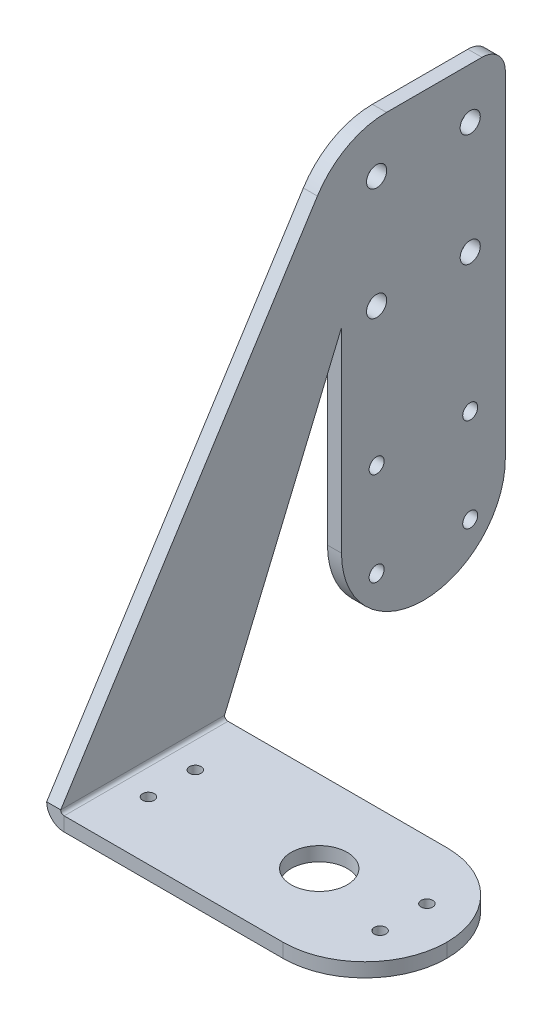
ISO-10303-21;
HEADER;
FILE_DESCRIPTION(('STEP AP214'),'2;1');
FILE_NAME('part.step','',(''),(''),'','','');
FILE_SCHEMA(('AUTOMOTIVE_DESIGN { 1 0 10303 214 1 1 1 1 }'));
ENDSEC;
DATA;
#1=APPLICATION_CONTEXT('core data for automotive mechanical design processes');
#2=APPLICATION_PROTOCOL_DEFINITION('international standard','automotive_design',2000,#1);
#3=PRODUCT_CONTEXT('',#1,'mechanical');
#4=PRODUCT('Part','Part','',(#3));
#5=PRODUCT_RELATED_PRODUCT_CATEGORY('part','',(#4));
#6=PRODUCT_DEFINITION_FORMATION('','',#4);
#7=PRODUCT_DEFINITION_CONTEXT('part definition',#1,'design');
#8=PRODUCT_DEFINITION('design','',#6,#7);
#9=PRODUCT_DEFINITION_SHAPE('','',#8);
#10=(LENGTH_UNIT() NAMED_UNIT(*) SI_UNIT(.MILLI.,.METRE.));
#11=(NAMED_UNIT(*) PLANE_ANGLE_UNIT() SI_UNIT($,.RADIAN.));
#12=(NAMED_UNIT(*) SI_UNIT($,.STERADIAN.) SOLID_ANGLE_UNIT());
#13=UNCERTAINTY_MEASURE_WITH_UNIT(LENGTH_MEASURE(1.E-05),#10,'distance_accuracy_value','');
#14=(GEOMETRIC_REPRESENTATION_CONTEXT(3) GLOBAL_UNCERTAINTY_ASSIGNED_CONTEXT((#13)) GLOBAL_UNIT_ASSIGNED_CONTEXT((#10,
#11,#12)) REPRESENTATION_CONTEXT('',''));
#15=CARTESIAN_POINT('',(0.,0.,0.));
#16=DIRECTION('',(0.,0.,1.));
#17=DIRECTION('',(1.,0.,0.));
#18=AXIS2_PLACEMENT_3D('',#15,#16,#17);
#19=CARTESIAN_POINT('',(0.,-3.,95.));
#20=DIRECTION('',(0.,1.,0.));
#21=DIRECTION('',(0.,0.,1.));
#22=AXIS2_PLACEMENT_3D('',#19,#20,#21);
#23=PLANE('',#22);
#24=CARTESIAN_POINT('',(6.2466000000001,-3.,82.5));
#25=DIRECTION('',(0.,1.,0.));
#26=DIRECTION('',(0.,0.,1.));
#27=AXIS2_PLACEMENT_3D('',#24,#25,#26);
#28=CIRCLE('',#27,1.25);
#29=CARTESIAN_POINT('',(6.2466000000001,-3.,83.75));
#30=VERTEX_POINT('',#29);
#31=EDGE_CURVE('E372',#30,#30,#28,.T.);
#32=ORIENTED_EDGE('',*,*,#31,.T.);
#33=EDGE_LOOP('',(#32));
#34=FACE_BOUND('',#33,.T.);
#35=CARTESIAN_POINT('',(55.7466000000001,-3.,82.5));
#36=DIRECTION('',(0.,1.,0.));
#37=DIRECTION('',(0.,0.,1.));
#38=AXIS2_PLACEMENT_3D('',#35,#36,#37);
#39=CIRCLE('',#38,1.25);
#40=CARTESIAN_POINT('',(55.7466000000001,-3.,83.75));
#41=VERTEX_POINT('',#40);
#42=EDGE_CURVE('E375',#41,#41,#39,.T.);
#43=ORIENTED_EDGE('',*,*,#42,.T.);
#44=EDGE_LOOP('',(#43));
#45=FACE_BOUND('',#44,.T.);
#46=CARTESIAN_POINT('',(55.7466,-3.,72.5));
#47=DIRECTION('',(0.,1.,0.));
#48=DIRECTION('',(0.,0.,1.));
#49=AXIS2_PLACEMENT_3D('',#46,#47,#48);
#50=CIRCLE('',#49,1.25);
#51=CARTESIAN_POINT('',(55.7466,-3.,73.75));
#52=VERTEX_POINT('',#51);
#53=EDGE_CURVE('E378',#52,#52,#50,.T.);
#54=ORIENTED_EDGE('',*,*,#53,.T.);
#55=EDGE_LOOP('',(#54));
#56=FACE_BOUND('',#55,.T.);
#57=CARTESIAN_POINT('',(6.2466,-3.,72.5));
#58=DIRECTION('',(0.,1.,0.));
#59=DIRECTION('',(0.,0.,1.));
#60=AXIS2_PLACEMENT_3D('',#57,#58,#59);
#61=CIRCLE('',#60,1.25);
#62=CARTESIAN_POINT('',(6.2466,-3.,73.75));
#63=VERTEX_POINT('',#62);
#64=EDGE_CURVE('E381',#63,#63,#61,.T.);
#65=ORIENTED_EDGE('',*,*,#64,.T.);
#66=EDGE_LOOP('',(#65));
#67=FACE_BOUND('',#66,.T.);
#68=CARTESIAN_POINT('',(37.7366,-3.,77.4999999999999));
#69=DIRECTION('',(0.,1.,0.));
#70=DIRECTION('',(0.,0.,1.));
#71=AXIS2_PLACEMENT_3D('',#68,#69,#70);
#72=CIRCLE('',#71,6.);
#73=CARTESIAN_POINT('',(37.7366,-3.,83.4999999999999));
#74=VERTEX_POINT('',#73);
#75=EDGE_CURVE('E290',#74,#74,#72,.T.);
#76=ORIENTED_EDGE('',*,*,#75,.T.);
#77=EDGE_LOOP('',(#76));
#78=FACE_BOUND('',#77,.T.);
#79=DIRECTION('',(1.,0.,0.));
#80=VECTOR('',#79,1.);
#81=CARTESIAN_POINT('',(32.8683,-3.,60.));
#82=LINE('',#81,#80);
#83=CARTESIAN_POINT('',(47.5,-3.,60.));
#84=VERTEX_POINT('',#83);
#85=CARTESIAN_POINT('',(0.736600000000011,-3.,60.));
#86=VERTEX_POINT('',#85);
#87=EDGE_CURVE('E187',#84,#86,#82,.F.);
#88=ORIENTED_EDGE('',*,*,#87,.F.);
#89=CARTESIAN_POINT('',(47.5,-3.,77.5));
#90=DIRECTION('',(0.,1.,0.));
#91=DIRECTION('',(0.,0.,1.));
#92=AXIS2_PLACEMENT_3D('',#89,#90,#91);
#93=CIRCLE('',#92,17.5);
#94=CARTESIAN_POINT('',(65.,-3.,77.5));
#95=VERTEX_POINT('',#94);
#96=EDGE_CURVE('E284',#84,#95,#93,.F.);
#97=ORIENTED_EDGE('',*,*,#96,.T.);
#98=CARTESIAN_POINT('',(47.5,-3.,77.5));
#99=DIRECTION('',(0.,1.,0.));
#100=DIRECTION('',(0.,0.,1.));
#101=AXIS2_PLACEMENT_3D('',#98,#99,#100);
#102=CIRCLE('',#101,17.5);
#103=CARTESIAN_POINT('',(47.5,-3.,95.));
#104=VERTEX_POINT('',#103);
#105=EDGE_CURVE('E225',#95,#104,#102,.F.);
#106=ORIENTED_EDGE('',*,*,#105,.T.);
#107=DIRECTION('',(1.,0.,0.));
#108=VECTOR('',#107,1.);
#109=CARTESIAN_POINT('',(0.,-3.,95.));
#110=LINE('',#109,#108);
#111=CARTESIAN_POINT('',(0.7366,-3.,95.));
#112=VERTEX_POINT('',#111);
#113=EDGE_CURVE('E315',#112,#104,#110,.T.);
#114=ORIENTED_EDGE('',*,*,#113,.F.);
#115=DIRECTION('',(0.,0.,-1.));
#116=VECTOR('',#115,1.);
#117=CARTESIAN_POINT('',(0.7366,-3.,95.));
#118=LINE('',#117,#116);
#119=EDGE_CURVE('E308',#112,#86,#118,.T.);
#120=ORIENTED_EDGE('',*,*,#119,.T.);
#121=EDGE_LOOP('',(#88,#97,#106,#114,#120));
#122=FACE_BOUND('',#121,.T.);
#123=ADVANCED_FACE('F69',(#34,#45,#56,#67,#78,#122),#23,.F.);
#124=CARTESIAN_POINT('',(0.,0.,95.));
#125=DIRECTION('',(0.,1.,0.));
#126=DIRECTION('',(0.,0.,1.));
#127=AXIS2_PLACEMENT_3D('',#124,#125,#126);
#128=PLANE('',#127);
#129=CARTESIAN_POINT('',(6.2466000000001,0.,82.5));
#130=DIRECTION('',(0.,1.,0.));
#131=DIRECTION('',(0.,0.,1.));
#132=AXIS2_PLACEMENT_3D('',#129,#130,#131);
#133=CIRCLE('',#132,1.25);
#134=CARTESIAN_POINT('',(6.2466000000001,0.,83.75));
#135=VERTEX_POINT('',#134);
#136=EDGE_CURVE('E388',#135,#135,#133,.T.);
#137=ORIENTED_EDGE('',*,*,#136,.F.);
#138=EDGE_LOOP('',(#137));
#139=FACE_BOUND('',#138,.T.);
#140=CARTESIAN_POINT('',(55.7466000000001,0.,82.5));
#141=DIRECTION('',(0.,1.,0.));
#142=DIRECTION('',(0.,0.,1.));
#143=AXIS2_PLACEMENT_3D('',#140,#141,#142);
#144=CIRCLE('',#143,1.25);
#145=CARTESIAN_POINT('',(55.7466000000001,0.,83.75));
#146=VERTEX_POINT('',#145);
#147=EDGE_CURVE('E391',#146,#146,#144,.T.);
#148=ORIENTED_EDGE('',*,*,#147,.F.);
#149=EDGE_LOOP('',(#148));
#150=FACE_BOUND('',#149,.T.);
#151=CARTESIAN_POINT('',(55.7466,0.,72.5));
#152=DIRECTION('',(0.,1.,0.));
#153=DIRECTION('',(0.,0.,1.));
#154=AXIS2_PLACEMENT_3D('',#151,#152,#153);
#155=CIRCLE('',#154,1.25);
#156=CARTESIAN_POINT('',(55.7466,0.,73.75));
#157=VERTEX_POINT('',#156);
#158=EDGE_CURVE('E387',#157,#157,#155,.T.);
#159=ORIENTED_EDGE('',*,*,#158,.F.);
#160=EDGE_LOOP('',(#159));
#161=FACE_BOUND('',#160,.T.);
#162=CARTESIAN_POINT('',(6.2466,0.,72.5));
#163=DIRECTION('',(0.,1.,0.));
#164=DIRECTION('',(0.,0.,1.));
#165=AXIS2_PLACEMENT_3D('',#162,#163,#164);
#166=CIRCLE('',#165,1.25);
#167=CARTESIAN_POINT('',(6.2466,0.,73.75));
#168=VERTEX_POINT('',#167);
#169=EDGE_CURVE('E384',#168,#168,#166,.T.);
#170=ORIENTED_EDGE('',*,*,#169,.F.);
#171=EDGE_LOOP('',(#170));
#172=FACE_BOUND('',#171,.T.);
#173=CARTESIAN_POINT('',(37.7366,0.,77.4999999999999));
#174=DIRECTION('',(0.,1.,0.));
#175=DIRECTION('',(0.,0.,1.));
#176=AXIS2_PLACEMENT_3D('',#173,#174,#175);
#177=CIRCLE('',#176,6.);
#178=CARTESIAN_POINT('',(37.7366,0.,83.4999999999999));
#179=VERTEX_POINT('',#178);
#180=EDGE_CURVE('E369',#179,#179,#177,.T.);
#181=ORIENTED_EDGE('',*,*,#180,.F.);
#182=EDGE_LOOP('',(#181));
#183=FACE_BOUND('',#182,.T.);
#184=CARTESIAN_POINT('',(47.5,0.,77.5));
#185=DIRECTION('',(0.,1.,0.));
#186=DIRECTION('',(0.,0.,1.));
#187=AXIS2_PLACEMENT_3D('',#184,#185,#186);
#188=CIRCLE('',#187,17.5);
#189=CARTESIAN_POINT('',(47.5,0.,95.));
#190=VERTEX_POINT('',#189);
#191=CARTESIAN_POINT('',(65.,0.,77.5));
#192=VERTEX_POINT('',#191);
#193=EDGE_CURVE('E229',#190,#192,#188,.T.);
#194=ORIENTED_EDGE('',*,*,#193,.T.);
#195=CARTESIAN_POINT('',(47.5,0.,77.5));
#196=DIRECTION('',(0.,1.,0.));
#197=DIRECTION('',(0.,0.,1.));
#198=AXIS2_PLACEMENT_3D('',#195,#196,#197);
#199=CIRCLE('',#198,17.5);
#200=CARTESIAN_POINT('',(47.5,0.,60.));
#201=VERTEX_POINT('',#200);
#202=EDGE_CURVE('E182',#192,#201,#199,.T.);
#203=ORIENTED_EDGE('',*,*,#202,.T.);
#204=DIRECTION('',(-1.,0.,0.));
#205=VECTOR('',#204,1.);
#206=CARTESIAN_POINT('',(0.,0.,60.));
#207=LINE('',#206,#205);
#208=CARTESIAN_POINT('',(0.7366,0.,60.));
#209=VERTEX_POINT('',#208);
#210=EDGE_CURVE('E174',#201,#209,#207,.T.);
#211=ORIENTED_EDGE('',*,*,#210,.T.);
#212=DIRECTION('',(0.,0.,-1.));
#213=VECTOR('',#212,1.);
#214=CARTESIAN_POINT('',(0.7366,0.,95.));
#215=LINE('',#214,#213);
#216=CARTESIAN_POINT('',(0.7366,0.,95.));
#217=VERTEX_POINT('',#216);
#218=EDGE_CURVE('E180',#217,#209,#215,.T.);
#219=ORIENTED_EDGE('',*,*,#218,.F.);
#220=DIRECTION('',(1.,0.,0.));
#221=VECTOR('',#220,1.);
#222=CARTESIAN_POINT('',(0.,0.,95.));
#223=LINE('',#222,#221);
#224=EDGE_CURVE('E321',#217,#190,#223,.T.);
#225=ORIENTED_EDGE('',*,*,#224,.T.);
#226=EDGE_LOOP('',(#194,#203,#211,#219,#225));
#227=FACE_BOUND('',#226,.T.);
#228=ADVANCED_FACE('F177',(#139,#150,#161,#172,#183,#227),#128,.T.);
#229=CARTESIAN_POINT('',(0.7366,0.7366,95.));
#230=DIRECTION('',(0.,0.,-1.));
#231=DIRECTION('',(-1.,0.,0.));
#232=AXIS2_PLACEMENT_3D('',#229,#230,#231);
#233=CYLINDRICAL_SURFACE('',#232,0.7366);
#234=ORIENTED_EDGE('',*,*,#218,.T.);
#235=CARTESIAN_POINT('',(0.7366,0.7366,60.));
#236=DIRECTION('',(0.,0.,1.));
#237=DIRECTION('',(1.,0.,0.));
#238=AXIS2_PLACEMENT_3D('',#235,#236,#237);
#239=CIRCLE('',#238,0.7366);
#240=CARTESIAN_POINT('',(0.,0.7366,60.));
#241=VERTEX_POINT('',#240);
#242=EDGE_CURVE('E186',#241,#209,#239,.T.);
#243=ORIENTED_EDGE('',*,*,#242,.F.);
#244=DIRECTION('',(0.,0.,-1.));
#245=VECTOR('',#244,1.);
#246=CARTESIAN_POINT('',(0.,0.7366,95.));
#247=LINE('',#246,#245);
#248=CARTESIAN_POINT('',(0.,0.7366,95.));
#249=VERTEX_POINT('',#248);
#250=EDGE_CURVE('E211',#249,#241,#247,.T.);
#251=ORIENTED_EDGE('',*,*,#250,.F.);
#252=CARTESIAN_POINT('',(0.7366,0.7366,95.));
#253=DIRECTION('',(0.,0.,-1.));
#254=DIRECTION('',(-1.,0.,0.));
#255=AXIS2_PLACEMENT_3D('',#252,#253,#254);
#256=CIRCLE('',#255,0.7366);
#257=EDGE_CURVE('E209',#249,#217,#256,.F.);
#258=ORIENTED_EDGE('',*,*,#257,.T.);
#259=EDGE_LOOP('',(#234,#243,#251,#258));
#260=FACE_BOUND('',#259,.T.);
#261=ADVANCED_FACE('F207',(#260),#233,.F.);
#262=CARTESIAN_POINT('',(0.7366,0.7366,95.));
#263=DIRECTION('',(0.,0.,-1.));
#264=DIRECTION('',(-1.,0.,0.));
#265=AXIS2_PLACEMENT_3D('',#262,#263,#264);
#266=CYLINDRICAL_SURFACE('',#265,3.7366);
#267=CARTESIAN_POINT('',(0.7366,0.7366,60.));
#268=DIRECTION('',(0.,0.,-1.));
#269=DIRECTION('',(-1.,0.,0.));
#270=AXIS2_PLACEMENT_3D('',#267,#268,#269);
#271=CIRCLE('',#270,3.7366);
#272=CARTESIAN_POINT('',(-3.,0.736600000000014,60.));
#273=VERTEX_POINT('',#272);
#274=EDGE_CURVE('E200',#273,#86,#271,.F.);
#275=ORIENTED_EDGE('',*,*,#274,.T.);
#276=ORIENTED_EDGE('',*,*,#119,.F.);
#277=CARTESIAN_POINT('',(0.7366,0.7366,95.));
#278=DIRECTION('',(0.,0.,1.));
#279=DIRECTION('',(1.,0.,0.));
#280=AXIS2_PLACEMENT_3D('',#277,#278,#279);
#281=CIRCLE('',#280,3.7366);
#282=CARTESIAN_POINT('',(-3.,0.7366,95.));
#283=VERTEX_POINT('',#282);
#284=EDGE_CURVE('E311',#283,#112,#281,.T.);
#285=ORIENTED_EDGE('',*,*,#284,.F.);
#286=DIRECTION('',(0.,0.,-1.));
#287=VECTOR('',#286,1.);
#288=CARTESIAN_POINT('',(-3.,0.7366,95.));
#289=LINE('',#288,#287);
#290=EDGE_CURVE('E303',#283,#273,#289,.T.);
#291=ORIENTED_EDGE('',*,*,#290,.T.);
#292=EDGE_LOOP('',(#275,#276,#285,#291));
#293=FACE_BOUND('',#292,.T.);
#294=ADVANCED_FACE('F438',(#293),#266,.T.);
#295=CARTESIAN_POINT('',(0.,0.,95.));
#296=DIRECTION('',(1.,0.,0.));
#297=DIRECTION('',(0.,0.,-1.));
#298=AXIS2_PLACEMENT_3D('',#295,#296,#297);
#299=PLANE('',#298);
#300=CARTESIAN_POINT('',(0.,30.7366,7.5));
#301=DIRECTION('',(1.,0.,0.));
#302=DIRECTION('',(0.,0.,-1.));
#303=AXIS2_PLACEMENT_3D('',#300,#301,#302);
#304=CIRCLE('',#303,1.6);
#305=CARTESIAN_POINT('',(0.,30.7366,5.9));
#306=VERTEX_POINT('',#305);
#307=EDGE_CURVE('E334',#306,#306,#304,.T.);
#308=ORIENTED_EDGE('',*,*,#307,.F.);
#309=EDGE_LOOP('',(#308));
#310=FACE_BOUND('',#309,.T.);
#311=CARTESIAN_POINT('',(0.,84.2366000000001,27.5));
#312=DIRECTION('',(1.,0.,0.));
#313=DIRECTION('',(0.,0.,-1.));
#314=AXIS2_PLACEMENT_3D('',#311,#312,#313);
#315=CIRCLE('',#314,2.15);
#316=CARTESIAN_POINT('',(0.,84.2366000000001,25.35));
#317=VERTEX_POINT('',#316);
#318=EDGE_CURVE('E331',#317,#317,#315,.T.);
#319=ORIENTED_EDGE('',*,*,#318,.F.);
#320=EDGE_LOOP('',(#319));
#321=FACE_BOUND('',#320,.T.);
#322=CARTESIAN_POINT('',(0.,84.2366000000001,7.5));
#323=DIRECTION('',(1.,0.,0.));
#324=DIRECTION('',(0.,0.,-1.));
#325=AXIS2_PLACEMENT_3D('',#322,#323,#324);
#326=CIRCLE('',#325,2.15);
#327=CARTESIAN_POINT('',(0.,84.2366000000001,5.35));
#328=VERTEX_POINT('',#327);
#329=EDGE_CURVE('E328',#328,#328,#326,.T.);
#330=ORIENTED_EDGE('',*,*,#329,.F.);
#331=EDGE_LOOP('',(#330));
#332=FACE_BOUND('',#331,.T.);
#333=CARTESIAN_POINT('',(0.,60.2366,27.4999999999997));
#334=DIRECTION('',(1.,0.,0.));
#335=DIRECTION('',(0.,0.,-1.));
#336=AXIS2_PLACEMENT_3D('',#333,#334,#335);
#337=CIRCLE('',#336,2.14999999999999);
#338=CARTESIAN_POINT('',(0.,60.2366,25.3499999999998));
#339=VERTEX_POINT('',#338);
#340=EDGE_CURVE('E327',#339,#339,#337,.T.);
#341=ORIENTED_EDGE('',*,*,#340,.F.);
#342=EDGE_LOOP('',(#341));
#343=FACE_BOUND('',#342,.T.);
#344=CARTESIAN_POINT('',(0.,10.7366,7.5));
#345=DIRECTION('',(1.,0.,0.));
#346=DIRECTION('',(0.,0.,-1.));
#347=AXIS2_PLACEMENT_3D('',#344,#345,#346);
#348=CIRCLE('',#347,1.6);
#349=CARTESIAN_POINT('',(0.,10.7366,5.9));
#350=VERTEX_POINT('',#349);
#351=EDGE_CURVE('E337',#350,#350,#348,.T.);
#352=ORIENTED_EDGE('',*,*,#351,.F.);
#353=EDGE_LOOP('',(#352));
#354=FACE_BOUND('',#353,.T.);
#355=CARTESIAN_POINT('',(0.,10.7365999999999,27.5));
#356=DIRECTION('',(1.,0.,0.));
#357=DIRECTION('',(0.,0.,-1.));
#358=AXIS2_PLACEMENT_3D('',#355,#356,#357);
#359=CIRCLE('',#358,1.6);
#360=CARTESIAN_POINT('',(0.,10.7365999999999,25.9));
#361=VERTEX_POINT('',#360);
#362=EDGE_CURVE('E343',#361,#361,#359,.T.);
#363=ORIENTED_EDGE('',*,*,#362,.F.);
#364=EDGE_LOOP('',(#363));
#365=FACE_BOUND('',#364,.T.);
#366=CARTESIAN_POINT('',(0.,30.7365999999999,27.5));
#367=DIRECTION('',(1.,0.,0.));
#368=DIRECTION('',(0.,0.,-1.));
#369=AXIS2_PLACEMENT_3D('',#366,#367,#368);
#370=CIRCLE('',#369,1.6);
#371=CARTESIAN_POINT('',(0.,30.7365999999999,25.9));
#372=VERTEX_POINT('',#371);
#373=EDGE_CURVE('E340',#372,#372,#370,.T.);
#374=ORIENTED_EDGE('',*,*,#373,.F.);
#375=EDGE_LOOP('',(#374));
#376=FACE_BOUND('',#375,.T.);
#377=CARTESIAN_POINT('',(0.,60.2366,7.49999999999975));
#378=DIRECTION('',(1.,0.,0.));
#379=DIRECTION('',(0.,0.,-1.));
#380=AXIS2_PLACEMENT_3D('',#377,#378,#379);
#381=CIRCLE('',#380,2.15);
#382=CARTESIAN_POINT('',(0.,60.2366,5.34999999999975));
#383=VERTEX_POINT('',#382);
#384=EDGE_CURVE('E236',#383,#383,#381,.T.);
#385=ORIENTED_EDGE('',*,*,#384,.F.);
#386=EDGE_LOOP('',(#385));
#387=FACE_BOUND('',#386,.T.);
#388=DIRECTION('',(0.,0.,-1.));
#389=VECTOR('',#388,1.);
#390=CARTESIAN_POINT('',(0.,95.,95.));
#391=LINE('',#390,#389);
#392=CARTESIAN_POINT('',(0.,95.,25.3946676760168));
#393=VERTEX_POINT('',#392);
#394=CARTESIAN_POINT('',(0.,95.,5.));
#395=VERTEX_POINT('',#394);
#396=EDGE_CURVE('E217',#393,#395,#391,.T.);
#397=ORIENTED_EDGE('',*,*,#396,.F.);
#398=CARTESIAN_POINT('',(0.,77.5,25.3946676760168));
#399=DIRECTION('',(1.,0.,0.));
#400=DIRECTION('',(0.,0.,-1.));
#401=AXIS2_PLACEMENT_3D('',#398,#399,#400);
#402=CIRCLE('',#401,17.5);
#403=CARTESIAN_POINT('',(0.,86.8969039770689,40.1577363152174));
#404=VERTEX_POINT('',#403);
#405=EDGE_CURVE('E91',#393,#404,#402,.T.);
#406=ORIENTED_EDGE('',*,*,#405,.T.);
#407=DIRECTION('',(0.,-0.843603922240032,0.536965941546793));
#408=VECTOR('',#407,1.);
#409=CARTESIAN_POINT('',(0.,0.212385662326017,95.3336699107017));
#410=LINE('',#409,#408);
#411=EDGE_CURVE('E355',#404,#249,#410,.T.);
#412=ORIENTED_EDGE('',*,*,#411,.T.);
#413=ORIENTED_EDGE('',*,*,#250,.T.);
#414=DIRECTION('',(0.,0.921373887192149,-0.388677449822381));
#415=VECTOR('',#414,1.);
#416=CARTESIAN_POINT('',(0.,-12.422825568381,65.5512447684325));
#417=LINE('',#416,#415);
#418=CARTESIAN_POINT('',(0.,60.,35.));
#419=VERTEX_POINT('',#418);
#420=EDGE_CURVE('E358',#241,#419,#417,.T.);
#421=ORIENTED_EDGE('',*,*,#420,.T.);
#422=DIRECTION('',(0.,-1.,0.));
#423=VECTOR('',#422,1.);
#424=CARTESIAN_POINT('',(0.,0.,35.));
#425=LINE('',#424,#423);
#426=CARTESIAN_POINT('',(0.,18.2366,35.));
#427=VERTEX_POINT('',#426);
#428=EDGE_CURVE('E350',#419,#427,#425,.T.);
#429=ORIENTED_EDGE('',*,*,#428,.T.);
#430=CARTESIAN_POINT('',(0.,18.2366,17.5));
#431=DIRECTION('',(1.,0.,0.));
#432=DIRECTION('',(0.,0.,-1.));
#433=AXIS2_PLACEMENT_3D('',#430,#431,#432);
#434=CIRCLE('',#433,17.5);
#435=CARTESIAN_POINT('',(0.,0.7366,17.5));
#436=VERTEX_POINT('',#435);
#437=EDGE_CURVE('E273',#427,#436,#434,.T.);
#438=ORIENTED_EDGE('',*,*,#437,.T.);
#439=CARTESIAN_POINT('',(0.,18.2366,17.5));
#440=DIRECTION('',(1.,0.,0.));
#441=DIRECTION('',(0.,0.,-1.));
#442=AXIS2_PLACEMENT_3D('',#439,#440,#441);
#443=CIRCLE('',#442,17.5);
#444=CARTESIAN_POINT('',(0.,18.2366,0.));
#445=VERTEX_POINT('',#444);
#446=EDGE_CURVE('E271',#436,#445,#443,.T.);
#447=ORIENTED_EDGE('',*,*,#446,.T.);
#448=DIRECTION('',(0.,-1.,0.));
#449=VECTOR('',#448,1.);
#450=CARTESIAN_POINT('',(0.,0.,0.));
#451=LINE('',#450,#449);
#452=CARTESIAN_POINT('',(0.,90.,0.));
#453=VERTEX_POINT('',#452);
#454=EDGE_CURVE('E257',#453,#445,#451,.T.);
#455=ORIENTED_EDGE('',*,*,#454,.F.);
#456=CARTESIAN_POINT('',(0.,90.,5.));
#457=DIRECTION('',(1.,0.,0.));
#458=DIRECTION('',(0.,0.,-1.));
#459=AXIS2_PLACEMENT_3D('',#456,#457,#458);
#460=CIRCLE('',#459,5.);
#461=EDGE_CURVE('E260',#453,#395,#460,.T.);
#462=ORIENTED_EDGE('',*,*,#461,.T.);
#463=EDGE_LOOP('',(#397,#406,#412,#413,#421,#429,#438,#447,#455,#462));
#464=FACE_BOUND('',#463,.T.);
#465=ADVANCED_FACE('F300',(#310,#321,#332,#343,#354,#365,#376,#387,#464),#299,.T.);
#466=CARTESIAN_POINT('',(-3.,95.,95.));
#467=DIRECTION('',(0.,1.,0.));
#468=DIRECTION('',(0.,0.,1.));
#469=AXIS2_PLACEMENT_3D('',#466,#467,#468);
#470=PLANE('',#469);
#471=DIRECTION('',(0.,0.,-1.));
#472=VECTOR('',#471,1.);
#473=CARTESIAN_POINT('',(-3.,95.,95.));
#474=LINE('',#473,#472);
#475=CARTESIAN_POINT('',(-3.,95.,25.3946676760168));
#476=VERTEX_POINT('',#475);
#477=CARTESIAN_POINT('',(-3.,95.,5.));
#478=VERTEX_POINT('',#477);
#479=EDGE_CURVE('E297',#476,#478,#474,.T.);
#480=ORIENTED_EDGE('',*,*,#479,.F.);
#481=DIRECTION('',(-1.,0.,0.));
#482=VECTOR('',#481,1.);
#483=CARTESIAN_POINT('',(-3.,95.,25.3946676760168));
#484=LINE('',#483,#482);
#485=EDGE_CURVE('E286',#476,#393,#484,.F.);
#486=ORIENTED_EDGE('',*,*,#485,.T.);
#487=ORIENTED_EDGE('',*,*,#396,.T.);
#488=DIRECTION('',(1.,0.,0.));
#489=VECTOR('',#488,1.);
#490=CARTESIAN_POINT('',(-3.,95.,5.));
#491=LINE('',#490,#489);
#492=EDGE_CURVE('E231',#395,#478,#491,.F.);
#493=ORIENTED_EDGE('',*,*,#492,.T.);
#494=EDGE_LOOP('',(#480,#486,#487,#493));
#495=FACE_BOUND('',#494,.T.);
#496=ADVANCED_FACE('F296',(#495),#470,.T.);
#497=CARTESIAN_POINT('',(-3.,0.,95.));
#498=DIRECTION('',(1.,0.,0.));
#499=DIRECTION('',(0.,0.,-1.));
#500=AXIS2_PLACEMENT_3D('',#497,#498,#499);
#501=PLANE('',#500);
#502=CARTESIAN_POINT('',(-3.,30.7366,7.5));
#503=DIRECTION('',(1.,0.,0.));
#504=DIRECTION('',(0.,0.,-1.));
#505=AXIS2_PLACEMENT_3D('',#502,#503,#504);
#506=CIRCLE('',#505,1.6);
#507=CARTESIAN_POINT('',(-3.,30.7366,5.9));
#508=VERTEX_POINT('',#507);
#509=EDGE_CURVE('E254',#508,#508,#506,.T.);
#510=ORIENTED_EDGE('',*,*,#509,.T.);
#511=EDGE_LOOP('',(#510));
#512=FACE_BOUND('',#511,.T.);
#513=CARTESIAN_POINT('',(-3.,84.2366000000001,27.5));
#514=DIRECTION('',(1.,0.,0.));
#515=DIRECTION('',(0.,0.,-1.));
#516=AXIS2_PLACEMENT_3D('',#513,#514,#515);
#517=CIRCLE('',#516,2.15);
#518=CARTESIAN_POINT('',(-3.,84.2366000000001,25.35));
#519=VERTEX_POINT('',#518);
#520=EDGE_CURVE('E251',#519,#519,#517,.T.);
#521=ORIENTED_EDGE('',*,*,#520,.T.);
#522=EDGE_LOOP('',(#521));
#523=FACE_BOUND('',#522,.T.);
#524=CARTESIAN_POINT('',(-3.,84.2366000000001,7.5));
#525=DIRECTION('',(1.,0.,0.));
#526=DIRECTION('',(0.,0.,-1.));
#527=AXIS2_PLACEMENT_3D('',#524,#525,#526);
#528=CIRCLE('',#527,2.15);
#529=CARTESIAN_POINT('',(-3.,84.2366000000001,5.35));
#530=VERTEX_POINT('',#529);
#531=EDGE_CURVE('E248',#530,#530,#528,.T.);
#532=ORIENTED_EDGE('',*,*,#531,.T.);
#533=EDGE_LOOP('',(#532));
#534=FACE_BOUND('',#533,.T.);
#535=CARTESIAN_POINT('',(-3.,60.2366,27.4999999999997));
#536=DIRECTION('',(1.,0.,0.));
#537=DIRECTION('',(0.,0.,-1.));
#538=AXIS2_PLACEMENT_3D('',#535,#536,#537);
#539=CIRCLE('',#538,2.14999999999999);
#540=CARTESIAN_POINT('',(-3.,60.2366,25.3499999999998));
#541=VERTEX_POINT('',#540);
#542=EDGE_CURVE('E245',#541,#541,#539,.T.);
#543=ORIENTED_EDGE('',*,*,#542,.T.);
#544=EDGE_LOOP('',(#543));
#545=FACE_BOUND('',#544,.T.);
#546=CARTESIAN_POINT('',(-3.,10.7366,7.5));
#547=DIRECTION('',(1.,0.,0.));
#548=DIRECTION('',(0.,0.,-1.));
#549=AXIS2_PLACEMENT_3D('',#546,#547,#548);
#550=CIRCLE('',#549,1.6);
#551=CARTESIAN_POINT('',(-3.,10.7366,5.9));
#552=VERTEX_POINT('',#551);
#553=EDGE_CURVE('E242',#552,#552,#550,.T.);
#554=ORIENTED_EDGE('',*,*,#553,.T.);
#555=EDGE_LOOP('',(#554));
#556=FACE_BOUND('',#555,.T.);
#557=CARTESIAN_POINT('',(-3.,10.7365999999999,27.5));
#558=DIRECTION('',(1.,0.,0.));
#559=DIRECTION('',(0.,0.,-1.));
#560=AXIS2_PLACEMENT_3D('',#557,#558,#559);
#561=CIRCLE('',#560,1.6);
#562=CARTESIAN_POINT('',(-3.,10.7365999999999,25.9));
#563=VERTEX_POINT('',#562);
#564=EDGE_CURVE('E239',#563,#563,#561,.T.);
#565=ORIENTED_EDGE('',*,*,#564,.T.);
#566=EDGE_LOOP('',(#565));
#567=FACE_BOUND('',#566,.T.);
#568=CARTESIAN_POINT('',(-3.,30.7365999999999,27.5));
#569=DIRECTION('',(1.,0.,0.));
#570=DIRECTION('',(0.,0.,-1.));
#571=AXIS2_PLACEMENT_3D('',#568,#569,#570);
#572=CIRCLE('',#571,1.6);
#573=CARTESIAN_POINT('',(-3.,30.7365999999999,25.9));
#574=VERTEX_POINT('',#573);
#575=EDGE_CURVE('E235',#574,#574,#572,.T.);
#576=ORIENTED_EDGE('',*,*,#575,.T.);
#577=EDGE_LOOP('',(#576));
#578=FACE_BOUND('',#577,.T.);
#579=CARTESIAN_POINT('',(-3.,60.2366,7.49999999999975));
#580=DIRECTION('',(1.,0.,0.));
#581=DIRECTION('',(0.,0.,-1.));
#582=AXIS2_PLACEMENT_3D('',#579,#580,#581);
#583=CIRCLE('',#582,2.15);
#584=CARTESIAN_POINT('',(-3.,60.2366,5.34999999999975));
#585=VERTEX_POINT('',#584);
#586=EDGE_CURVE('E232',#585,#585,#583,.T.);
#587=ORIENTED_EDGE('',*,*,#586,.T.);
#588=EDGE_LOOP('',(#587));
#589=FACE_BOUND('',#588,.T.);
#590=DIRECTION('',(0.,-0.843603922240032,0.536965941546793));
#591=VECTOR('',#590,1.);
#592=CARTESIAN_POINT('',(-3.,0.212385662326017,95.3336699107017));
#593=LINE('',#592,#591);
#594=CARTESIAN_POINT('',(-3.,86.8969039770689,40.1577363152174));
#595=VERTEX_POINT('',#594);
#596=EDGE_CURVE('E204',#595,#283,#593,.T.);
#597=ORIENTED_EDGE('',*,*,#596,.F.);
#598=CARTESIAN_POINT('',(-3.,77.5,25.3946676760168));
#599=DIRECTION('',(1.,0.,0.));
#600=DIRECTION('',(0.,0.,-1.));
#601=AXIS2_PLACEMENT_3D('',#598,#599,#600);
#602=CIRCLE('',#601,17.5);
#603=EDGE_CURVE('E12',#595,#476,#602,.F.);
#604=ORIENTED_EDGE('',*,*,#603,.T.);
#605=ORIENTED_EDGE('',*,*,#479,.T.);
#606=CARTESIAN_POINT('',(-3.,90.,5.));
#607=DIRECTION('',(1.,0.,0.));
#608=DIRECTION('',(0.,0.,-1.));
#609=AXIS2_PLACEMENT_3D('',#606,#607,#608);
#610=CIRCLE('',#609,5.);
#611=CARTESIAN_POINT('',(-3.,90.,0.));
#612=VERTEX_POINT('',#611);
#613=EDGE_CURVE('E263',#478,#612,#610,.F.);
#614=ORIENTED_EDGE('',*,*,#613,.T.);
#615=DIRECTION('',(0.,1.,0.));
#616=VECTOR('',#615,1.);
#617=CARTESIAN_POINT('',(-3.,0.,0.));
#618=LINE('',#617,#616);
#619=CARTESIAN_POINT('',(-3.,18.2366,0.));
#620=VERTEX_POINT('',#619);
#621=EDGE_CURVE('E312',#612,#620,#618,.F.);
#622=ORIENTED_EDGE('',*,*,#621,.T.);
#623=CARTESIAN_POINT('',(-3.,18.2366,17.5));
#624=DIRECTION('',(1.,0.,0.));
#625=DIRECTION('',(0.,0.,-1.));
#626=AXIS2_PLACEMENT_3D('',#623,#624,#625);
#627=CIRCLE('',#626,17.5);
#628=CARTESIAN_POINT('',(-3.,0.7366,17.5));
#629=VERTEX_POINT('',#628);
#630=EDGE_CURVE('E275',#620,#629,#627,.F.);
#631=ORIENTED_EDGE('',*,*,#630,.T.);
#632=CARTESIAN_POINT('',(-3.,18.2366,17.5));
#633=DIRECTION('',(1.,0.,0.));
#634=DIRECTION('',(0.,0.,-1.));
#635=AXIS2_PLACEMENT_3D('',#632,#633,#634);
#636=CIRCLE('',#635,17.5);
#637=CARTESIAN_POINT('',(-3.,18.2366,35.));
#638=VERTEX_POINT('',#637);
#639=EDGE_CURVE('E277',#629,#638,#636,.F.);
#640=ORIENTED_EDGE('',*,*,#639,.T.);
#641=DIRECTION('',(0.,1.,0.));
#642=VECTOR('',#641,1.);
#643=CARTESIAN_POINT('',(-3.,30.3683,35.));
#644=LINE('',#643,#642);
#645=CARTESIAN_POINT('',(-3.,60.,35.));
#646=VERTEX_POINT('',#645);
#647=EDGE_CURVE('E354',#646,#638,#644,.F.);
#648=ORIENTED_EDGE('',*,*,#647,.F.);
#649=DIRECTION('',(0.,0.921373887192149,-0.388677449822381));
#650=VECTOR('',#649,1.);
#651=CARTESIAN_POINT('',(-3.,-12.422825568381,65.5512447684325));
#652=LINE('',#651,#650);
#653=EDGE_CURVE('E352',#273,#646,#652,.T.);
#654=ORIENTED_EDGE('',*,*,#653,.F.);
#655=ORIENTED_EDGE('',*,*,#290,.F.);
#656=EDGE_LOOP('',(#597,#604,#605,#614,#622,#631,#640,#648,#654,#655));
#657=FACE_BOUND('',#656,.T.);
#658=ADVANCED_FACE('F445',(#512,#523,#534,#545,#556,#567,#578,#589,#657),#501,.F.);
#659=CARTESIAN_POINT('',(0.7366,0.,95.));
#660=DIRECTION('',(0.,0.,1.));
#661=DIRECTION('',(1.,0.,0.));
#662=AXIS2_PLACEMENT_3D('',#659,#660,#661);
#663=PLANE('',#662);
#664=DIRECTION('',(0.,-1.,0.));
#665=VECTOR('',#664,1.);
#666=CARTESIAN_POINT('',(0.7366,0.,95.));
#667=LINE('',#666,#665);
#668=EDGE_CURVE('E214',#217,#112,#667,.T.);
#669=ORIENTED_EDGE('',*,*,#668,.F.);
#670=ORIENTED_EDGE('',*,*,#257,.F.);
#671=DIRECTION('',(1.,0.,0.));
#672=VECTOR('',#671,1.);
#673=CARTESIAN_POINT('',(-3.,0.7366,95.));
#674=LINE('',#673,#672);
#675=EDGE_CURVE('E210',#283,#249,#674,.T.);
#676=ORIENTED_EDGE('',*,*,#675,.F.);
#677=ORIENTED_EDGE('',*,*,#284,.T.);
#678=EDGE_LOOP('',(#669,#670,#676,#677));
#679=FACE_BOUND('',#678,.T.);
#680=ADVANCED_FACE('F435',(#679),#663,.T.);
#681=CARTESIAN_POINT('',(-3.,0.7366,95.));
#682=DIRECTION('',(0.,0.,1.));
#683=DIRECTION('',(1.,0.,0.));
#684=AXIS2_PLACEMENT_3D('',#681,#682,#683);
#685=PLANE('',#684);
#686=ORIENTED_EDGE('',*,*,#113,.T.);
#687=DIRECTION('',(0.,-1.,0.));
#688=VECTOR('',#687,1.);
#689=CARTESIAN_POINT('',(47.5,0.7366,95.));
#690=LINE('',#689,#688);
#691=EDGE_CURVE('E227',#104,#190,#690,.F.);
#692=ORIENTED_EDGE('',*,*,#691,.T.);
#693=ORIENTED_EDGE('',*,*,#224,.F.);
#694=ORIENTED_EDGE('',*,*,#668,.T.);
#695=EDGE_LOOP('',(#686,#692,#693,#694));
#696=FACE_BOUND('',#695,.T.);
#697=ADVANCED_FACE('F431',(#696),#685,.T.);
#698=CARTESIAN_POINT('',(0.7366,-3.,0.));
#699=DIRECTION('',(0.,0.,-1.));
#700=DIRECTION('',(-1.,0.,0.));
#701=AXIS2_PLACEMENT_3D('',#698,#699,#700);
#702=PLANE('',#701);
#703=ORIENTED_EDGE('',*,*,#454,.T.);
#704=DIRECTION('',(1.,0.,0.));
#705=VECTOR('',#704,1.);
#706=CARTESIAN_POINT('',(0.7366,18.2366,0.));
#707=LINE('',#706,#705);
#708=EDGE_CURVE('E279',#445,#620,#707,.F.);
#709=ORIENTED_EDGE('',*,*,#708,.T.);
#710=ORIENTED_EDGE('',*,*,#621,.F.);
#711=DIRECTION('',(1.,0.,0.));
#712=VECTOR('',#711,1.);
#713=CARTESIAN_POINT('',(0.7366,90.,0.));
#714=LINE('',#713,#712);
#715=EDGE_CURVE('E265',#612,#453,#714,.T.);
#716=ORIENTED_EDGE('',*,*,#715,.T.);
#717=EDGE_LOOP('',(#703,#709,#710,#716));
#718=FACE_BOUND('',#717,.T.);
#719=ADVANCED_FACE('F461',(#718),#702,.T.);
#720=CARTESIAN_POINT('',(47.5,0.,77.5));
#721=DIRECTION('',(0.,-1.,0.));
#722=DIRECTION('',(0.,0.,-1.));
#723=AXIS2_PLACEMENT_3D('',#720,#721,#722);
#724=CYLINDRICAL_SURFACE('',#723,17.5);
#725=ORIENTED_EDGE('',*,*,#193,.F.);
#726=ORIENTED_EDGE('',*,*,#691,.F.);
#727=ORIENTED_EDGE('',*,*,#105,.F.);
#728=DIRECTION('',(0.,-1.,0.));
#729=VECTOR('',#728,1.);
#730=CARTESIAN_POINT('',(65.,0.,77.5));
#731=LINE('',#730,#729);
#732=EDGE_CURVE('E222',#192,#95,#731,.T.);
#733=ORIENTED_EDGE('',*,*,#732,.F.);
#734=EDGE_LOOP('',(#725,#726,#727,#733));
#735=FACE_BOUND('',#734,.T.);
#736=ADVANCED_FACE('F428',(#735),#724,.T.);
#737=CARTESIAN_POINT('',(-10.,60.2366,7.49999999999975));
#738=DIRECTION('',(1.,0.,0.));
#739=DIRECTION('',(0.,0.,-1.));
#740=AXIS2_PLACEMENT_3D('',#737,#738,#739);
#741=CYLINDRICAL_SURFACE('',#740,2.15);
#742=ORIENTED_EDGE('',*,*,#384,.T.);
#743=EDGE_LOOP('',(#742));
#744=FACE_BOUND('',#743,.T.);
#745=ORIENTED_EDGE('',*,*,#586,.F.);
#746=EDGE_LOOP('',(#745));
#747=FACE_BOUND('',#746,.T.);
#748=ADVANCED_FACE('F608',(#744,#747),#741,.F.);
#749=CARTESIAN_POINT('',(-10.,30.7365999999999,27.5));
#750=DIRECTION('',(1.,0.,0.));
#751=DIRECTION('',(0.,0.,-1.));
#752=AXIS2_PLACEMENT_3D('',#749,#750,#751);
#753=CYLINDRICAL_SURFACE('',#752,1.6);
#754=ORIENTED_EDGE('',*,*,#373,.T.);
#755=EDGE_LOOP('',(#754));
#756=FACE_BOUND('',#755,.T.);
#757=ORIENTED_EDGE('',*,*,#575,.F.);
#758=EDGE_LOOP('',(#757));
#759=FACE_BOUND('',#758,.T.);
#760=ADVANCED_FACE('F635',(#756,#759),#753,.F.);
#761=CARTESIAN_POINT('',(-10.,10.7365999999999,27.5));
#762=DIRECTION('',(1.,0.,0.));
#763=DIRECTION('',(0.,0.,-1.));
#764=AXIS2_PLACEMENT_3D('',#761,#762,#763);
#765=CYLINDRICAL_SURFACE('',#764,1.6);
#766=ORIENTED_EDGE('',*,*,#362,.T.);
#767=EDGE_LOOP('',(#766));
#768=FACE_BOUND('',#767,.T.);
#769=ORIENTED_EDGE('',*,*,#564,.F.);
#770=EDGE_LOOP('',(#769));
#771=FACE_BOUND('',#770,.T.);
#772=ADVANCED_FACE('F631',(#768,#771),#765,.F.);
#773=CARTESIAN_POINT('',(-10.,10.7366,7.5));
#774=DIRECTION('',(1.,0.,0.));
#775=DIRECTION('',(0.,0.,-1.));
#776=AXIS2_PLACEMENT_3D('',#773,#774,#775);
#777=CYLINDRICAL_SURFACE('',#776,1.6);
#778=ORIENTED_EDGE('',*,*,#351,.T.);
#779=EDGE_LOOP('',(#778));
#780=FACE_BOUND('',#779,.T.);
#781=ORIENTED_EDGE('',*,*,#553,.F.);
#782=EDGE_LOOP('',(#781));
#783=FACE_BOUND('',#782,.T.);
#784=ADVANCED_FACE('F627',(#780,#783),#777,.F.);
#785=CARTESIAN_POINT('',(-10.,60.2366,27.4999999999997));
#786=DIRECTION('',(1.,0.,0.));
#787=DIRECTION('',(0.,0.,-1.));
#788=AXIS2_PLACEMENT_3D('',#785,#786,#787);
#789=CYLINDRICAL_SURFACE('',#788,2.14999999999999);
#790=ORIENTED_EDGE('',*,*,#340,.T.);
#791=EDGE_LOOP('',(#790));
#792=FACE_BOUND('',#791,.T.);
#793=ORIENTED_EDGE('',*,*,#542,.F.);
#794=EDGE_LOOP('',(#793));
#795=FACE_BOUND('',#794,.T.);
#796=ADVANCED_FACE('F630',(#792,#795),#789,.F.);
#797=CARTESIAN_POINT('',(-10.,84.2366000000001,7.5));
#798=DIRECTION('',(1.,0.,0.));
#799=DIRECTION('',(0.,0.,-1.));
#800=AXIS2_PLACEMENT_3D('',#797,#798,#799);
#801=CYLINDRICAL_SURFACE('',#800,2.15);
#802=ORIENTED_EDGE('',*,*,#329,.T.);
#803=EDGE_LOOP('',(#802));
#804=FACE_BOUND('',#803,.T.);
#805=ORIENTED_EDGE('',*,*,#531,.F.);
#806=EDGE_LOOP('',(#805));
#807=FACE_BOUND('',#806,.T.);
#808=ADVANCED_FACE('F641',(#804,#807),#801,.F.);
#809=CARTESIAN_POINT('',(-10.,84.2366000000001,27.5));
#810=DIRECTION('',(1.,0.,0.));
#811=DIRECTION('',(0.,0.,-1.));
#812=AXIS2_PLACEMENT_3D('',#809,#810,#811);
#813=CYLINDRICAL_SURFACE('',#812,2.15);
#814=ORIENTED_EDGE('',*,*,#318,.T.);
#815=EDGE_LOOP('',(#814));
#816=FACE_BOUND('',#815,.T.);
#817=ORIENTED_EDGE('',*,*,#520,.F.);
#818=EDGE_LOOP('',(#817));
#819=FACE_BOUND('',#818,.T.);
#820=ADVANCED_FACE('F475',(#816,#819),#813,.F.);
#821=CARTESIAN_POINT('',(-10.,30.7366,7.5));
#822=DIRECTION('',(1.,0.,0.));
#823=DIRECTION('',(0.,0.,-1.));
#824=AXIS2_PLACEMENT_3D('',#821,#822,#823);
#825=CYLINDRICAL_SURFACE('',#824,1.6);
#826=ORIENTED_EDGE('',*,*,#307,.T.);
#827=EDGE_LOOP('',(#826));
#828=FACE_BOUND('',#827,.T.);
#829=ORIENTED_EDGE('',*,*,#509,.F.);
#830=EDGE_LOOP('',(#829));
#831=FACE_BOUND('',#830,.T.);
#832=ADVANCED_FACE('F468',(#828,#831),#825,.F.);
#833=CARTESIAN_POINT('',(0.7366,90.,5.));
#834=DIRECTION('',(1.,0.,0.));
#835=DIRECTION('',(0.,0.,-1.));
#836=AXIS2_PLACEMENT_3D('',#833,#834,#835);
#837=CYLINDRICAL_SURFACE('',#836,5.);
#838=ORIENTED_EDGE('',*,*,#613,.F.);
#839=ORIENTED_EDGE('',*,*,#492,.F.);
#840=ORIENTED_EDGE('',*,*,#461,.F.);
#841=ORIENTED_EDGE('',*,*,#715,.F.);
#842=EDGE_LOOP('',(#838,#839,#840,#841));
#843=FACE_BOUND('',#842,.T.);
#844=ADVANCED_FACE('F465',(#843),#837,.T.);
#845=CARTESIAN_POINT('',(0.,0.212385662326017,95.3336699107017));
#846=DIRECTION('',(0.,-0.536965941546793,-0.843603922240032));
#847=DIRECTION('',(0.,-0.843603922240032,0.536965941546793));
#848=AXIS2_PLACEMENT_3D('',#845,#846,#847);
#849=PLANE('',#848);
#850=ORIENTED_EDGE('',*,*,#411,.F.);
#851=DIRECTION('',(1.,0.,0.));
#852=VECTOR('',#851,1.);
#853=CARTESIAN_POINT('',(0.,86.8969039770689,40.1577363152174));
#854=LINE('',#853,#852);
#855=EDGE_CURVE('E77',#404,#595,#854,.F.);
#856=ORIENTED_EDGE('',*,*,#855,.T.);
#857=ORIENTED_EDGE('',*,*,#596,.T.);
#858=ORIENTED_EDGE('',*,*,#675,.T.);
#859=EDGE_LOOP('',(#850,#856,#857,#858));
#860=FACE_BOUND('',#859,.T.);
#861=ADVANCED_FACE('F467',(#860),#849,.F.);
#862=CARTESIAN_POINT('',(0.,0.,35.));
#863=DIRECTION('',(0.,0.,-1.));
#864=DIRECTION('',(0.,-1.,0.));
#865=AXIS2_PLACEMENT_3D('',#862,#863,#864);
#866=PLANE('',#865);
#867=ORIENTED_EDGE('',*,*,#647,.T.);
#868=DIRECTION('',(-1.,0.,0.));
#869=VECTOR('',#868,1.);
#870=CARTESIAN_POINT('',(0.,18.2366,35.));
#871=LINE('',#870,#869);
#872=EDGE_CURVE('E268',#638,#427,#871,.F.);
#873=ORIENTED_EDGE('',*,*,#872,.T.);
#874=ORIENTED_EDGE('',*,*,#428,.F.);
#875=DIRECTION('',(-1.,0.,0.));
#876=VECTOR('',#875,1.);
#877=CARTESIAN_POINT('',(0.,60.,35.));
#878=LINE('',#877,#876);
#879=EDGE_CURVE('E344',#646,#419,#878,.F.);
#880=ORIENTED_EDGE('',*,*,#879,.F.);
#881=EDGE_LOOP('',(#867,#873,#874,#880));
#882=FACE_BOUND('',#881,.T.);
#883=ADVANCED_FACE('F449',(#882),#866,.F.);
#884=CARTESIAN_POINT('',(0.,-12.422825568381,65.5512447684325));
#885=DIRECTION('',(0.,0.388677449822381,0.921373887192149));
#886=DIRECTION('',(0.,0.921373887192149,-0.388677449822381));
#887=AXIS2_PLACEMENT_3D('',#884,#885,#886);
#888=PLANE('',#887);
#889=ORIENTED_EDGE('',*,*,#653,.T.);
#890=ORIENTED_EDGE('',*,*,#879,.T.);
#891=ORIENTED_EDGE('',*,*,#420,.F.);
#892=DIRECTION('',(-1.,0.,0.));
#893=VECTOR('',#892,1.);
#894=CARTESIAN_POINT('',(0.,0.7366,60.));
#895=LINE('',#894,#893);
#896=EDGE_CURVE('E196',#273,#241,#895,.F.);
#897=ORIENTED_EDGE('',*,*,#896,.F.);
#898=EDGE_LOOP('',(#889,#890,#891,#897));
#899=FACE_BOUND('',#898,.T.);
#900=ADVANCED_FACE('F441',(#899),#888,.F.);
#901=CARTESIAN_POINT('',(0.7366,0.7366,60.));
#902=DIRECTION('',(0.,0.,-1.));
#903=DIRECTION('',(-1.,0.,0.));
#904=AXIS2_PLACEMENT_3D('',#901,#902,#903);
#905=PLANE('',#904);
#906=ORIENTED_EDGE('',*,*,#242,.T.);
#907=DIRECTION('',(0.,1.,0.));
#908=VECTOR('',#907,1.);
#909=CARTESIAN_POINT('',(0.7366,0.,60.));
#910=LINE('',#909,#908);
#911=EDGE_CURVE('E193',#209,#86,#910,.F.);
#912=ORIENTED_EDGE('',*,*,#911,.T.);
#913=ORIENTED_EDGE('',*,*,#274,.F.);
#914=ORIENTED_EDGE('',*,*,#896,.T.);
#915=EDGE_LOOP('',(#906,#912,#913,#914));
#916=FACE_BOUND('',#915,.T.);
#917=ADVANCED_FACE('F192',(#916),#905,.T.);
#918=CARTESIAN_POINT('',(0.,0.,60.));
#919=DIRECTION('',(0.,0.,1.));
#920=DIRECTION('',(-1.,0.,0.));
#921=AXIS2_PLACEMENT_3D('',#918,#919,#920);
#922=PLANE('',#921);
#923=ORIENTED_EDGE('',*,*,#210,.F.);
#924=DIRECTION('',(0.,1.,0.));
#925=VECTOR('',#924,1.);
#926=CARTESIAN_POINT('',(47.5,0.,60.));
#927=LINE('',#926,#925);
#928=EDGE_CURVE('E282',#201,#84,#927,.F.);
#929=ORIENTED_EDGE('',*,*,#928,.T.);
#930=ORIENTED_EDGE('',*,*,#87,.T.);
#931=ORIENTED_EDGE('',*,*,#911,.F.);
#932=EDGE_LOOP('',(#923,#929,#930,#931));
#933=FACE_BOUND('',#932,.T.);
#934=ADVANCED_FACE('F202',(#933),#922,.F.);
#935=CARTESIAN_POINT('',(0.7366,18.2366,17.5));
#936=DIRECTION('',(1.,0.,0.));
#937=DIRECTION('',(0.,0.,-1.));
#938=AXIS2_PLACEMENT_3D('',#935,#936,#937);
#939=CYLINDRICAL_SURFACE('',#938,17.5);
#940=DIRECTION('',(-1.,0.,0.));
#941=VECTOR('',#940,1.);
#942=CARTESIAN_POINT('',(0.,0.7366,17.5));
#943=LINE('',#942,#941);
#944=EDGE_CURVE('E287',#629,#436,#943,.F.);
#945=ORIENTED_EDGE('',*,*,#944,.F.);
#946=ORIENTED_EDGE('',*,*,#630,.F.);
#947=ORIENTED_EDGE('',*,*,#708,.F.);
#948=ORIENTED_EDGE('',*,*,#446,.F.);
#949=EDGE_LOOP('',(#945,#946,#947,#948));
#950=FACE_BOUND('',#949,.T.);
#951=ADVANCED_FACE('F457',(#950),#939,.T.);
#952=CARTESIAN_POINT('',(0.,18.2366,17.5));
#953=DIRECTION('',(1.,0.,0.));
#954=DIRECTION('',(0.,0.,-1.));
#955=AXIS2_PLACEMENT_3D('',#952,#953,#954);
#956=CYLINDRICAL_SURFACE('',#955,17.5);
#957=ORIENTED_EDGE('',*,*,#639,.F.);
#958=ORIENTED_EDGE('',*,*,#944,.T.);
#959=ORIENTED_EDGE('',*,*,#437,.F.);
#960=ORIENTED_EDGE('',*,*,#872,.F.);
#961=EDGE_LOOP('',(#957,#958,#959,#960));
#962=FACE_BOUND('',#961,.T.);
#963=ADVANCED_FACE('F452',(#962),#956,.T.);
#964=CARTESIAN_POINT('',(47.5,0.,77.5));
#965=DIRECTION('',(0.,-1.,0.));
#966=DIRECTION('',(0.,0.,-1.));
#967=AXIS2_PLACEMENT_3D('',#964,#965,#966);
#968=CYLINDRICAL_SURFACE('',#967,17.5);
#969=ORIENTED_EDGE('',*,*,#96,.F.);
#970=ORIENTED_EDGE('',*,*,#928,.F.);
#971=ORIENTED_EDGE('',*,*,#202,.F.);
#972=ORIENTED_EDGE('',*,*,#732,.T.);
#973=EDGE_LOOP('',(#969,#970,#971,#972));
#974=FACE_BOUND('',#973,.T.);
#975=ADVANCED_FACE('F424',(#974),#968,.T.);
#976=CARTESIAN_POINT('',(-3.,77.5,25.3946676760168));
#977=DIRECTION('',(-1.,0.,0.));
#978=DIRECTION('',(0.,0.,1.));
#979=AXIS2_PLACEMENT_3D('',#976,#977,#978);
#980=CYLINDRICAL_SURFACE('',#979,17.5);
#981=ORIENTED_EDGE('',*,*,#603,.F.);
#982=ORIENTED_EDGE('',*,*,#855,.F.);
#983=ORIENTED_EDGE('',*,*,#405,.F.);
#984=ORIENTED_EDGE('',*,*,#485,.F.);
#985=EDGE_LOOP('',(#981,#982,#983,#984));
#986=FACE_BOUND('',#985,.T.);
#987=ADVANCED_FACE('F71',(#986),#980,.T.);
#988=CARTESIAN_POINT('',(37.7366,-10.,77.4999999999999));
#989=DIRECTION('',(0.,1.,0.));
#990=DIRECTION('',(0.,0.,1.));
#991=AXIS2_PLACEMENT_3D('',#988,#989,#990);
#992=CYLINDRICAL_SURFACE('',#991,6.);
#993=ORIENTED_EDGE('',*,*,#180,.T.);
#994=EDGE_LOOP('',(#993));
#995=FACE_BOUND('',#994,.T.);
#996=ORIENTED_EDGE('',*,*,#75,.F.);
#997=EDGE_LOOP('',(#996));
#998=FACE_BOUND('',#997,.T.);
#999=ADVANCED_FACE('F408',(#995,#998),#992,.F.);
#1000=CARTESIAN_POINT('',(6.2466,-10.,72.5));
#1001=DIRECTION('',(0.,1.,0.));
#1002=DIRECTION('',(0.,0.,1.));
#1003=AXIS2_PLACEMENT_3D('',#1000,#1001,#1002);
#1004=CYLINDRICAL_SURFACE('',#1003,1.25);
#1005=ORIENTED_EDGE('',*,*,#169,.T.);
#1006=EDGE_LOOP('',(#1005));
#1007=FACE_BOUND('',#1006,.T.);
#1008=ORIENTED_EDGE('',*,*,#64,.F.);
#1009=EDGE_LOOP('',(#1008));
#1010=FACE_BOUND('',#1009,.T.);
#1011=ADVANCED_FACE('F411',(#1007,#1010),#1004,.F.);
#1012=CARTESIAN_POINT('',(55.7466,-10.,72.5));
#1013=DIRECTION('',(0.,1.,0.));
#1014=DIRECTION('',(0.,0.,1.));
#1015=AXIS2_PLACEMENT_3D('',#1012,#1013,#1014);
#1016=CYLINDRICAL_SURFACE('',#1015,1.25);
#1017=ORIENTED_EDGE('',*,*,#158,.T.);
#1018=EDGE_LOOP('',(#1017));
#1019=FACE_BOUND('',#1018,.T.);
#1020=ORIENTED_EDGE('',*,*,#53,.F.);
#1021=EDGE_LOOP('',(#1020));
#1022=FACE_BOUND('',#1021,.T.);
#1023=ADVANCED_FACE('F397',(#1019,#1022),#1016,.F.);
#1024=CARTESIAN_POINT('',(55.7466000000001,-10.,82.5));
#1025=DIRECTION('',(0.,1.,0.));
#1026=DIRECTION('',(0.,0.,1.));
#1027=AXIS2_PLACEMENT_3D('',#1024,#1025,#1026);
#1028=CYLINDRICAL_SURFACE('',#1027,1.25);
#1029=ORIENTED_EDGE('',*,*,#147,.T.);
#1030=EDGE_LOOP('',(#1029));
#1031=FACE_BOUND('',#1030,.T.);
#1032=ORIENTED_EDGE('',*,*,#42,.F.);
#1033=EDGE_LOOP('',(#1032));
#1034=FACE_BOUND('',#1033,.T.);
#1035=ADVANCED_FACE('F510',(#1031,#1034),#1028,.F.);
#1036=CARTESIAN_POINT('',(6.2466000000001,-10.,82.5));
#1037=DIRECTION('',(0.,1.,0.));
#1038=DIRECTION('',(0.,0.,1.));
#1039=AXIS2_PLACEMENT_3D('',#1036,#1037,#1038);
#1040=CYLINDRICAL_SURFACE('',#1039,1.25);
#1041=ORIENTED_EDGE('',*,*,#136,.T.);
#1042=EDGE_LOOP('',(#1041));
#1043=FACE_BOUND('',#1042,.T.);
#1044=ORIENTED_EDGE('',*,*,#31,.F.);
#1045=EDGE_LOOP('',(#1044));
#1046=FACE_BOUND('',#1045,.T.);
#1047=ADVANCED_FACE('F517',(#1043,#1046),#1040,.F.);
#1048=CLOSED_SHELL('',(#123,#228,#261,#294,#465,#496,#658,#680,#697,#719,#736,#748,#760,#772,
#784,#796,#808,#820,#832,#844,#861,#883,#900,#917,#934,#951,#963,#975,#987,#999,#1011,#1023,
#1035,#1047));
#1049=MANIFOLD_SOLID_BREP('B2',#1048);
#1050=ADVANCED_BREP_SHAPE_REPRESENTATION('',(#18,#1049),#14);
#1051=SHAPE_DEFINITION_REPRESENTATION(#9,#1050);
ENDSEC;
END-ISO-10303-21;
